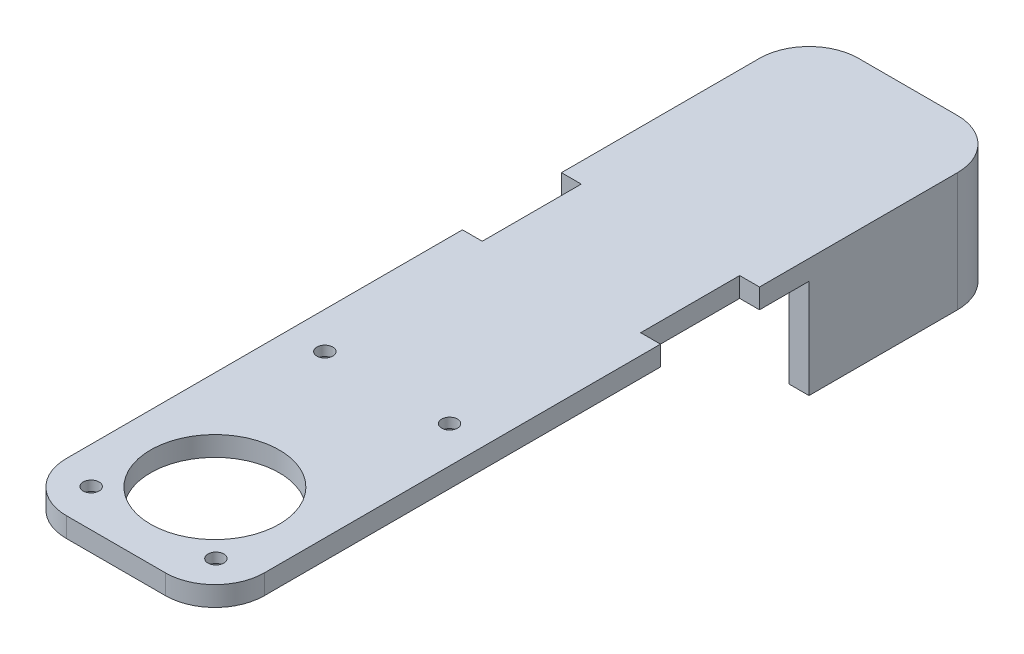
ISO-10303-21;
HEADER;
FILE_DESCRIPTION(('STEP AP214'),'2;1');
FILE_NAME('part.step','',(''),(''),'','','');
FILE_SCHEMA(('AUTOMOTIVE_DESIGN { 1 0 10303 214 1 1 1 1 }'));
ENDSEC;
DATA;
#1=APPLICATION_CONTEXT('core data for automotive mechanical design processes');
#2=APPLICATION_PROTOCOL_DEFINITION('international standard','automotive_design',2000,#1);
#3=PRODUCT_CONTEXT('',#1,'mechanical');
#4=PRODUCT('Part','Part','',(#3));
#5=PRODUCT_RELATED_PRODUCT_CATEGORY('part','',(#4));
#6=PRODUCT_DEFINITION_FORMATION('','',#4);
#7=PRODUCT_DEFINITION_CONTEXT('part definition',#1,'design');
#8=PRODUCT_DEFINITION('design','',#6,#7);
#9=PRODUCT_DEFINITION_SHAPE('','',#8);
#10=(LENGTH_UNIT() NAMED_UNIT(*) SI_UNIT(.MILLI.,.METRE.));
#11=(NAMED_UNIT(*) PLANE_ANGLE_UNIT() SI_UNIT($,.RADIAN.));
#12=(NAMED_UNIT(*) SI_UNIT($,.STERADIAN.) SOLID_ANGLE_UNIT());
#13=UNCERTAINTY_MEASURE_WITH_UNIT(LENGTH_MEASURE(1.E-05),#10,'distance_accuracy_value','');
#14=(GEOMETRIC_REPRESENTATION_CONTEXT(3) GLOBAL_UNCERTAINTY_ASSIGNED_CONTEXT((#13)) GLOBAL_UNIT_ASSIGNED_CONTEXT((#10,
#11,#12)) REPRESENTATION_CONTEXT('',''));
#15=CARTESIAN_POINT('',(0.,0.,0.));
#16=DIRECTION('',(0.,0.,1.));
#17=DIRECTION('',(1.,0.,0.));
#18=AXIS2_PLACEMENT_3D('',#15,#16,#17);
#19=CARTESIAN_POINT('',(-12.7,2.54,12.7));
#20=DIRECTION('',(1.,0.,0.));
#21=DIRECTION('',(0.,0.,-1.));
#22=AXIS2_PLACEMENT_3D('',#19,#20,#21);
#23=PLANE('',#22);
#24=DIRECTION('',(0.,0.,1.));
#25=VECTOR('',#24,1.);
#26=CARTESIAN_POINT('',(-12.7,2.54,12.7));
#27=LINE('',#26,#25);
#28=CARTESIAN_POINT('',(-12.7,2.54,-44.45));
#29=VERTEX_POINT('',#28);
#30=CARTESIAN_POINT('',(-12.7,2.54,6.35));
#31=VERTEX_POINT('',#30);
#32=EDGE_CURVE('E388',#29,#31,#27,.T.);
#33=ORIENTED_EDGE('',*,*,#32,.F.);
#34=DIRECTION('',(0.,-1.,0.));
#35=VECTOR('',#34,1.);
#36=CARTESIAN_POINT('',(-12.7,2.54,-44.45));
#37=LINE('',#36,#35);
#38=CARTESIAN_POINT('',(-12.7,0.,-44.45));
#39=VERTEX_POINT('',#38);
#40=EDGE_CURVE('E253',#29,#39,#37,.T.);
#41=ORIENTED_EDGE('',*,*,#40,.T.);
#42=DIRECTION('',(0.,0.,1.));
#43=VECTOR('',#42,1.);
#44=CARTESIAN_POINT('',(-12.7,0.,12.7));
#45=LINE('',#44,#43);
#46=CARTESIAN_POINT('',(-12.7,0.,6.35));
#47=VERTEX_POINT('',#46);
#48=EDGE_CURVE('E379',#39,#47,#45,.T.);
#49=ORIENTED_EDGE('',*,*,#48,.T.);
#50=DIRECTION('',(0.,-1.,0.));
#51=VECTOR('',#50,1.);
#52=CARTESIAN_POINT('',(-12.7,2.54,6.35));
#53=LINE('',#52,#51);
#54=EDGE_CURVE('E461',#47,#31,#53,.F.);
#55=ORIENTED_EDGE('',*,*,#54,.T.);
#56=EDGE_LOOP('',(#33,#41,#49,#55));
#57=FACE_BOUND('',#56,.T.);
#58=ADVANCED_FACE('F47',(#57),#23,.F.);
#59=CARTESIAN_POINT('',(12.7,2.54,12.7));
#60=DIRECTION('',(-1.,0.,0.));
#61=DIRECTION('',(0.,0.,1.));
#62=AXIS2_PLACEMENT_3D('',#59,#60,#61);
#63=PLANE('',#62);
#64=DIRECTION('',(0.,0.,-1.));
#65=VECTOR('',#64,1.);
#66=CARTESIAN_POINT('',(12.7,0.,12.7));
#67=LINE('',#66,#65);
#68=CARTESIAN_POINT('',(12.7,0.,6.35));
#69=VERTEX_POINT('',#68);
#70=CARTESIAN_POINT('',(12.7,0.,-44.45));
#71=VERTEX_POINT('',#70);
#72=EDGE_CURVE('E410',#69,#71,#67,.T.);
#73=ORIENTED_EDGE('',*,*,#72,.T.);
#74=DIRECTION('',(0.,-1.,0.));
#75=VECTOR('',#74,1.);
#76=CARTESIAN_POINT('',(12.7,2.54,-44.45));
#77=LINE('',#76,#75);
#78=CARTESIAN_POINT('',(12.7,2.54,-44.45));
#79=VERTEX_POINT('',#78);
#80=EDGE_CURVE('E238',#79,#71,#77,.T.);
#81=ORIENTED_EDGE('',*,*,#80,.F.);
#82=DIRECTION('',(0.,0.,-1.));
#83=VECTOR('',#82,1.);
#84=CARTESIAN_POINT('',(12.7,2.54,12.7));
#85=LINE('',#84,#83);
#86=CARTESIAN_POINT('',(12.7,2.54,6.35));
#87=VERTEX_POINT('',#86);
#88=EDGE_CURVE('E393',#87,#79,#85,.T.);
#89=ORIENTED_EDGE('',*,*,#88,.F.);
#90=DIRECTION('',(0.,-1.,0.));
#91=VECTOR('',#90,1.);
#92=CARTESIAN_POINT('',(12.7,2.54,6.35));
#93=LINE('',#92,#91);
#94=EDGE_CURVE('E421',#87,#69,#93,.T.);
#95=ORIENTED_EDGE('',*,*,#94,.T.);
#96=EDGE_LOOP('',(#73,#81,#89,#95));
#97=FACE_BOUND('',#96,.T.);
#98=ADVANCED_FACE('F500',(#97),#63,.F.);
#99=CARTESIAN_POINT('',(-8.000000002,-10.16,-22.098));
#100=DIRECTION('',(0.,1.,0.));
#101=DIRECTION('',(0.,0.,1.));
#102=AXIS2_PLACEMENT_3D('',#99,#100,#101);
#103=CYLINDRICAL_SURFACE('',#102,1.016);
#104=CARTESIAN_POINT('',(-8.000000002,2.54,-22.098));
#105=DIRECTION('',(0.,1.,0.));
#106=DIRECTION('',(0.,0.,1.));
#107=AXIS2_PLACEMENT_3D('',#104,#105,#106);
#108=CIRCLE('',#107,1.016);
#109=CARTESIAN_POINT('',(-8.000000002,2.54,-21.082));
#110=VERTEX_POINT('',#109);
#111=EDGE_CURVE('E317',#110,#110,#108,.T.);
#112=ORIENTED_EDGE('',*,*,#111,.T.);
#113=EDGE_LOOP('',(#112));
#114=FACE_BOUND('',#113,.T.);
#115=CARTESIAN_POINT('',(-8.000000002,1.27,-22.098));
#116=DIRECTION('',(0.,-1.,0.));
#117=DIRECTION('',(0.,0.,-1.));
#118=AXIS2_PLACEMENT_3D('',#115,#116,#117);
#119=CIRCLE('',#118,1.016);
#120=CARTESIAN_POINT('',(-8.000000002,1.27,-23.114));
#121=VERTEX_POINT('',#120);
#122=EDGE_CURVE('E51',#121,#121,#119,.F.);
#123=ORIENTED_EDGE('',*,*,#122,.F.);
#124=EDGE_LOOP('',(#123));
#125=FACE_BOUND('',#124,.T.);
#126=ADVANCED_FACE('F497',(#114,#125),#103,.F.);
#127=CARTESIAN_POINT('',(8.000000002,-10.16,7.874));
#128=DIRECTION('',(0.,1.,0.));
#129=DIRECTION('',(0.,0.,1.));
#130=AXIS2_PLACEMENT_3D('',#127,#128,#129);
#131=CYLINDRICAL_SURFACE('',#130,1.016);
#132=CARTESIAN_POINT('',(8.000000002,2.54,7.874));
#133=DIRECTION('',(0.,1.,0.));
#134=DIRECTION('',(0.,0.,-1.));
#135=AXIS2_PLACEMENT_3D('',#132,#133,#134);
#136=CIRCLE('',#135,1.016);
#137=CARTESIAN_POINT('',(8.000000002,2.54,6.858));
#138=VERTEX_POINT('',#137);
#139=EDGE_CURVE('E308',#138,#138,#136,.T.);
#140=ORIENTED_EDGE('',*,*,#139,.T.);
#141=EDGE_LOOP('',(#140));
#142=FACE_BOUND('',#141,.T.);
#143=CARTESIAN_POINT('',(8.000000002,1.27,7.874));
#144=DIRECTION('',(0.,-1.,0.));
#145=DIRECTION('',(0.,0.,-1.));
#146=AXIS2_PLACEMENT_3D('',#143,#144,#145);
#147=CIRCLE('',#146,1.016);
#148=CARTESIAN_POINT('',(8.000000002,1.27,6.858));
#149=VERTEX_POINT('',#148);
#150=EDGE_CURVE('E486',#149,#149,#147,.F.);
#151=ORIENTED_EDGE('',*,*,#150,.F.);
#152=EDGE_LOOP('',(#151));
#153=FACE_BOUND('',#152,.T.);
#154=ADVANCED_FACE('F499',(#142,#153),#131,.F.);
#155=CARTESIAN_POINT('',(-8.000000002,-10.16,7.874));
#156=DIRECTION('',(0.,1.,0.));
#157=DIRECTION('',(0.,0.,1.));
#158=AXIS2_PLACEMENT_3D('',#155,#156,#157);
#159=CYLINDRICAL_SURFACE('',#158,1.016);
#160=CARTESIAN_POINT('',(-8.000000002,2.54,7.874));
#161=DIRECTION('',(0.,1.,0.));
#162=DIRECTION('',(0.,0.,1.));
#163=AXIS2_PLACEMENT_3D('',#160,#161,#162);
#164=CIRCLE('',#163,1.016);
#165=CARTESIAN_POINT('',(-8.000000002,2.54,8.89));
#166=VERTEX_POINT('',#165);
#167=EDGE_CURVE('E312',#166,#166,#164,.T.);
#168=ORIENTED_EDGE('',*,*,#167,.T.);
#169=EDGE_LOOP('',(#168));
#170=FACE_BOUND('',#169,.T.);
#171=CARTESIAN_POINT('',(-8.000000002,1.27,7.874));
#172=DIRECTION('',(0.,-1.,0.));
#173=DIRECTION('',(0.,0.,-1.));
#174=AXIS2_PLACEMENT_3D('',#171,#172,#173);
#175=CIRCLE('',#174,1.016);
#176=CARTESIAN_POINT('',(-8.000000002,1.27,6.858));
#177=VERTEX_POINT('',#176);
#178=EDGE_CURVE('E483',#177,#177,#175,.F.);
#179=ORIENTED_EDGE('',*,*,#178,.F.);
#180=EDGE_LOOP('',(#179));
#181=FACE_BOUND('',#180,.T.);
#182=ADVANCED_FACE('F507',(#170,#181),#159,.F.);
#183=CARTESIAN_POINT('',(8.000000002,-10.16,-22.098));
#184=DIRECTION('',(0.,1.,0.));
#185=DIRECTION('',(0.,0.,1.));
#186=AXIS2_PLACEMENT_3D('',#183,#184,#185);
#187=CYLINDRICAL_SURFACE('',#186,1.016);
#188=CARTESIAN_POINT('',(8.000000002,2.54,-22.098));
#189=DIRECTION('',(0.,1.,0.));
#190=DIRECTION('',(0.,0.,-1.));
#191=AXIS2_PLACEMENT_3D('',#188,#189,#190);
#192=CIRCLE('',#191,1.016);
#193=CARTESIAN_POINT('',(8.000000002,2.54,-23.114));
#194=VERTEX_POINT('',#193);
#195=EDGE_CURVE('E313',#194,#194,#192,.T.);
#196=ORIENTED_EDGE('',*,*,#195,.T.);
#197=EDGE_LOOP('',(#196));
#198=FACE_BOUND('',#197,.T.);
#199=CARTESIAN_POINT('',(8.000000002,1.27,-22.098));
#200=DIRECTION('',(0.,-1.,0.));
#201=DIRECTION('',(0.,0.,-1.));
#202=AXIS2_PLACEMENT_3D('',#199,#200,#201);
#203=CIRCLE('',#202,1.016);
#204=CARTESIAN_POINT('',(8.000000002,1.27,-23.114));
#205=VERTEX_POINT('',#204);
#206=EDGE_CURVE('E304',#205,#205,#203,.F.);
#207=ORIENTED_EDGE('',*,*,#206,.F.);
#208=EDGE_LOOP('',(#207));
#209=FACE_BOUND('',#208,.T.);
#210=ADVANCED_FACE('F658',(#198,#209),#187,.F.);
#211=CARTESIAN_POINT('',(0.,0.,0.));
#212=DIRECTION('',(0.,-1.,0.));
#213=DIRECTION('',(0.,0.,-1.));
#214=AXIS2_PLACEMENT_3D('',#211,#212,#213);
#215=PLANE('',#214);
#216=DIRECTION('',(-1.,0.,0.));
#217=VECTOR('',#216,1.);
#218=CARTESIAN_POINT('',(10.16,0.,-44.45));
#219=LINE('',#218,#217);
#220=CARTESIAN_POINT('',(10.16,0.,-44.45));
#221=VERTEX_POINT('',#220);
#222=EDGE_CURVE('E221',#71,#221,#219,.T.);
#223=ORIENTED_EDGE('',*,*,#222,.F.);
#224=ORIENTED_EDGE('',*,*,#72,.F.);
#225=CARTESIAN_POINT('',(6.35,0.,6.35));
#226=DIRECTION('',(0.,-1.,0.));
#227=DIRECTION('',(0.,0.,-1.));
#228=AXIS2_PLACEMENT_3D('',#225,#226,#227);
#229=CIRCLE('',#228,6.35);
#230=CARTESIAN_POINT('',(6.35,0.,12.7));
#231=VERTEX_POINT('',#230);
#232=EDGE_CURVE('E435',#69,#231,#229,.T.);
#233=ORIENTED_EDGE('',*,*,#232,.T.);
#234=DIRECTION('',(1.,0.,0.));
#235=VECTOR('',#234,1.);
#236=CARTESIAN_POINT('',(-12.7,0.,12.7));
#237=LINE('',#236,#235);
#238=CARTESIAN_POINT('',(-6.35,0.,12.7));
#239=VERTEX_POINT('',#238);
#240=EDGE_CURVE('E405',#239,#231,#237,.T.);
#241=ORIENTED_EDGE('',*,*,#240,.F.);
#242=CARTESIAN_POINT('',(-6.35,0.,6.35));
#243=DIRECTION('',(0.,-1.,0.));
#244=DIRECTION('',(0.,0.,-1.));
#245=AXIS2_PLACEMENT_3D('',#242,#243,#244);
#246=CIRCLE('',#245,6.35);
#247=EDGE_CURVE('E431',#239,#47,#246,.T.);
#248=ORIENTED_EDGE('',*,*,#247,.T.);
#249=ORIENTED_EDGE('',*,*,#48,.F.);
#250=DIRECTION('',(-1.,0.,0.));
#251=VECTOR('',#250,1.);
#252=CARTESIAN_POINT('',(-12.7,0.,-44.45));
#253=LINE('',#252,#251);
#254=CARTESIAN_POINT('',(-10.16,0.,-44.45));
#255=VERTEX_POINT('',#254);
#256=EDGE_CURVE('E257',#255,#39,#253,.T.);
#257=ORIENTED_EDGE('',*,*,#256,.F.);
#258=DIRECTION('',(0.,0.,1.));
#259=VECTOR('',#258,1.);
#260=CARTESIAN_POINT('',(-10.16,0.,-44.45));
#261=LINE('',#260,#259);
#262=CARTESIAN_POINT('',(-10.16,0.,-57.15));
#263=VERTEX_POINT('',#262);
#264=EDGE_CURVE('E260',#263,#255,#261,.T.);
#265=ORIENTED_EDGE('',*,*,#264,.F.);
#266=DIRECTION('',(1.,0.,0.));
#267=VECTOR('',#266,1.);
#268=CARTESIAN_POINT('',(-12.7,0.,-57.15));
#269=LINE('',#268,#267);
#270=CARTESIAN_POINT('',(-12.7,0.,-57.15));
#271=VERTEX_POINT('',#270);
#272=EDGE_CURVE('E231',#271,#263,#269,.T.);
#273=ORIENTED_EDGE('',*,*,#272,.F.);
#274=CARTESIAN_POINT('',(-12.7,0.,-63.5));
#275=VERTEX_POINT('',#274);
#276=EDGE_CURVE('E401',#275,#271,#45,.T.);
#277=ORIENTED_EDGE('',*,*,#276,.F.);
#278=DIRECTION('',(-1.,0.,0.));
#279=VECTOR('',#278,1.);
#280=CARTESIAN_POINT('',(-12.7,0.,-63.5));
#281=LINE('',#280,#279);
#282=CARTESIAN_POINT('',(-10.16,0.,-63.5));
#283=VERTEX_POINT('',#282);
#284=EDGE_CURVE('E355',#283,#275,#281,.T.);
#285=ORIENTED_EDGE('',*,*,#284,.F.);
#286=DIRECTION('',(0.,0.,1.));
#287=VECTOR('',#286,1.);
#288=CARTESIAN_POINT('',(-10.16,0.,-88.9));
#289=LINE('',#288,#287);
#290=CARTESIAN_POINT('',(-10.16,0.,-87.63));
#291=VERTEX_POINT('',#290);
#292=EDGE_CURVE('E341',#291,#283,#289,.T.);
#293=ORIENTED_EDGE('',*,*,#292,.F.);
#294=CARTESIAN_POINT('',(-6.35,0.,-82.55));
#295=DIRECTION('',(0.,-1.,0.));
#296=DIRECTION('',(0.,0.,-1.));
#297=AXIS2_PLACEMENT_3D('',#294,#295,#296);
#298=CIRCLE('',#297,6.35);
#299=CARTESIAN_POINT('',(-6.35,0.,-88.9));
#300=VERTEX_POINT('',#299);
#301=EDGE_CURVE('E425',#291,#300,#298,.T.);
#302=ORIENTED_EDGE('',*,*,#301,.T.);
#303=DIRECTION('',(-1.,0.,0.));
#304=VECTOR('',#303,1.);
#305=CARTESIAN_POINT('',(-12.7,0.,-88.9));
#306=LINE('',#305,#304);
#307=CARTESIAN_POINT('',(6.35,0.,-88.9));
#308=VERTEX_POINT('',#307);
#309=EDGE_CURVE('E414',#308,#300,#306,.T.);
#310=ORIENTED_EDGE('',*,*,#309,.F.);
#311=CARTESIAN_POINT('',(6.35,0.,-82.55));
#312=DIRECTION('',(0.,-1.,0.));
#313=DIRECTION('',(0.,0.,-1.));
#314=AXIS2_PLACEMENT_3D('',#311,#312,#313);
#315=CIRCLE('',#314,6.35);
#316=CARTESIAN_POINT('',(10.16,0.,-87.63));
#317=VERTEX_POINT('',#316);
#318=EDGE_CURVE('E428',#308,#317,#315,.T.);
#319=ORIENTED_EDGE('',*,*,#318,.T.);
#320=DIRECTION('',(0.,0.,-1.));
#321=VECTOR('',#320,1.);
#322=CARTESIAN_POINT('',(10.16,0.,-88.9));
#323=LINE('',#322,#321);
#324=CARTESIAN_POINT('',(10.16,0.,-63.5));
#325=VERTEX_POINT('',#324);
#326=EDGE_CURVE('E333',#325,#317,#323,.T.);
#327=ORIENTED_EDGE('',*,*,#326,.F.);
#328=DIRECTION('',(-1.,0.,0.));
#329=VECTOR('',#328,1.);
#330=CARTESIAN_POINT('',(12.7,0.,-63.5));
#331=LINE('',#330,#329);
#332=CARTESIAN_POINT('',(12.7,0.,-63.5));
#333=VERTEX_POINT('',#332);
#334=EDGE_CURVE('E337',#333,#325,#331,.T.);
#335=ORIENTED_EDGE('',*,*,#334,.F.);
#336=CARTESIAN_POINT('',(12.7,0.,-57.15));
#337=VERTEX_POINT('',#336);
#338=EDGE_CURVE('E409',#337,#333,#67,.T.);
#339=ORIENTED_EDGE('',*,*,#338,.F.);
#340=DIRECTION('',(1.,0.,0.));
#341=VECTOR('',#340,1.);
#342=CARTESIAN_POINT('',(10.16,0.,-57.15));
#343=LINE('',#342,#341);
#344=CARTESIAN_POINT('',(10.16,0.,-57.15));
#345=VERTEX_POINT('',#344);
#346=EDGE_CURVE('E73',#345,#337,#343,.T.);
#347=ORIENTED_EDGE('',*,*,#346,.F.);
#348=DIRECTION('',(0.,0.,-1.));
#349=VECTOR('',#348,1.);
#350=CARTESIAN_POINT('',(10.16,0.,-44.45));
#351=LINE('',#350,#349);
#352=EDGE_CURVE('E205',#221,#345,#351,.T.);
#353=ORIENTED_EDGE('',*,*,#352,.F.);
#354=EDGE_LOOP('',(#223,#224,#233,#241,#248,#249,#257,#265,#273,#277,#285,#293,#302,#310,#319,
#327,#335,#339,#347,#353));
#355=FACE_BOUND('',#354,.T.);
#356=CARTESIAN_POINT('',(-8.000000002,0.,7.874));
#357=DIRECTION('',(0.,-1.,0.));
#358=DIRECTION('',(0.,0.,-1.));
#359=AXIS2_PLACEMENT_3D('',#356,#357,#358);
#360=CIRCLE('',#359,2.032);
#361=CARTESIAN_POINT('',(-8.000000002,0.,5.842));
#362=VERTEX_POINT('',#361);
#363=EDGE_CURVE('E293',#362,#362,#360,.T.);
#364=ORIENTED_EDGE('',*,*,#363,.F.);
#365=EDGE_LOOP('',(#364));
#366=FACE_BOUND('',#365,.T.);
#367=CARTESIAN_POINT('',(8.000000002,0.,7.874));
#368=DIRECTION('',(0.,-1.,0.));
#369=DIRECTION('',(0.,0.,-1.));
#370=AXIS2_PLACEMENT_3D('',#367,#368,#369);
#371=CIRCLE('',#370,2.032);
#372=CARTESIAN_POINT('',(8.000000002,0.,5.842));
#373=VERTEX_POINT('',#372);
#374=EDGE_CURVE('E285',#373,#373,#371,.T.);
#375=ORIENTED_EDGE('',*,*,#374,.F.);
#376=EDGE_LOOP('',(#375));
#377=FACE_BOUND('',#376,.T.);
#378=CARTESIAN_POINT('',(8.000000002,0.,-22.098));
#379=DIRECTION('',(0.,-1.,0.));
#380=DIRECTION('',(0.,0.,-1.));
#381=AXIS2_PLACEMENT_3D('',#378,#379,#380);
#382=CIRCLE('',#381,2.032);
#383=CARTESIAN_POINT('',(8.000000002,0.,-24.13));
#384=VERTEX_POINT('',#383);
#385=EDGE_CURVE('E276',#384,#384,#382,.T.);
#386=ORIENTED_EDGE('',*,*,#385,.F.);
#387=EDGE_LOOP('',(#386));
#388=FACE_BOUND('',#387,.T.);
#389=CARTESIAN_POINT('',(-8.000000002,0.,-22.098));
#390=DIRECTION('',(0.,-1.,0.));
#391=DIRECTION('',(0.,0.,-1.));
#392=AXIS2_PLACEMENT_3D('',#389,#390,#391);
#393=CIRCLE('',#392,2.032);
#394=CARTESIAN_POINT('',(-8.000000002,0.,-24.13));
#395=VERTEX_POINT('',#394);
#396=EDGE_CURVE('E280',#395,#395,#393,.T.);
#397=ORIENTED_EDGE('',*,*,#396,.F.);
#398=EDGE_LOOP('',(#397));
#399=FACE_BOUND('',#398,.T.);
#400=CARTESIAN_POINT('',(0.,0.,0.));
#401=DIRECTION('',(0.,1.,0.));
#402=DIRECTION('',(0.,0.,1.));
#403=AXIS2_PLACEMENT_3D('',#400,#401,#402);
#404=CIRCLE('',#403,8.255);
#405=CARTESIAN_POINT('',(0.,0.,8.255));
#406=VERTEX_POINT('',#405);
#407=EDGE_CURVE('E374',#406,#406,#404,.T.);
#408=ORIENTED_EDGE('',*,*,#407,.T.);
#409=EDGE_LOOP('',(#408));
#410=FACE_BOUND('',#409,.T.);
#411=ADVANCED_FACE('F535',(#355,#366,#377,#388,#399,#410),#215,.T.);
#412=CARTESIAN_POINT('',(0.,2.54,0.));
#413=DIRECTION('',(0.,-1.,0.));
#414=DIRECTION('',(0.,0.,-1.));
#415=AXIS2_PLACEMENT_3D('',#412,#413,#414);
#416=PLANE('',#415);
#417=ORIENTED_EDGE('',*,*,#195,.F.);
#418=EDGE_LOOP('',(#417));
#419=FACE_BOUND('',#418,.T.);
#420=ORIENTED_EDGE('',*,*,#167,.F.);
#421=EDGE_LOOP('',(#420));
#422=FACE_BOUND('',#421,.T.);
#423=ORIENTED_EDGE('',*,*,#139,.F.);
#424=EDGE_LOOP('',(#423));
#425=FACE_BOUND('',#424,.T.);
#426=ORIENTED_EDGE('',*,*,#111,.F.);
#427=EDGE_LOOP('',(#426));
#428=FACE_BOUND('',#427,.T.);
#429=ORIENTED_EDGE('',*,*,#88,.T.);
#430=DIRECTION('',(-1.,0.,0.));
#431=VECTOR('',#430,1.);
#432=CARTESIAN_POINT('',(10.16,2.54,-44.45));
#433=LINE('',#432,#431);
#434=CARTESIAN_POINT('',(10.16,2.54,-44.45));
#435=VERTEX_POINT('',#434);
#436=EDGE_CURVE('E208',#79,#435,#433,.T.);
#437=ORIENTED_EDGE('',*,*,#436,.T.);
#438=DIRECTION('',(0.,0.,-1.));
#439=VECTOR('',#438,1.);
#440=CARTESIAN_POINT('',(10.16,2.54,-44.45));
#441=LINE('',#440,#439);
#442=CARTESIAN_POINT('',(10.16,2.54,-57.15));
#443=VERTEX_POINT('',#442);
#444=EDGE_CURVE('E202',#435,#443,#441,.T.);
#445=ORIENTED_EDGE('',*,*,#444,.T.);
#446=DIRECTION('',(1.,0.,0.));
#447=VECTOR('',#446,1.);
#448=CARTESIAN_POINT('',(10.16,2.54,-57.15));
#449=LINE('',#448,#447);
#450=CARTESIAN_POINT('',(12.7,2.54,-57.15));
#451=VERTEX_POINT('',#450);
#452=EDGE_CURVE('E211',#443,#451,#449,.T.);
#453=ORIENTED_EDGE('',*,*,#452,.T.);
#454=CARTESIAN_POINT('',(12.7,2.54,-82.55));
#455=VERTEX_POINT('',#454);
#456=EDGE_CURVE('E392',#451,#455,#85,.T.);
#457=ORIENTED_EDGE('',*,*,#456,.T.);
#458=CARTESIAN_POINT('',(6.35,2.54,-82.55));
#459=DIRECTION('',(0.,-1.,0.));
#460=DIRECTION('',(0.,0.,-1.));
#461=AXIS2_PLACEMENT_3D('',#458,#459,#460);
#462=CIRCLE('',#461,6.35);
#463=CARTESIAN_POINT('',(6.35,2.54,-88.9));
#464=VERTEX_POINT('',#463);
#465=EDGE_CURVE('E448',#455,#464,#462,.F.);
#466=ORIENTED_EDGE('',*,*,#465,.T.);
#467=DIRECTION('',(-1.,0.,0.));
#468=VECTOR('',#467,1.);
#469=CARTESIAN_POINT('',(-12.7,2.54,-88.9));
#470=LINE('',#469,#468);
#471=CARTESIAN_POINT('',(-6.35,2.54,-88.9));
#472=VERTEX_POINT('',#471);
#473=EDGE_CURVE('E396',#464,#472,#470,.T.);
#474=ORIENTED_EDGE('',*,*,#473,.T.);
#475=CARTESIAN_POINT('',(-6.35,2.54,-82.55));
#476=DIRECTION('',(0.,-1.,0.));
#477=DIRECTION('',(0.,0.,-1.));
#478=AXIS2_PLACEMENT_3D('',#475,#476,#477);
#479=CIRCLE('',#478,6.35);
#480=CARTESIAN_POINT('',(-12.7,2.54,-82.55));
#481=VERTEX_POINT('',#480);
#482=EDGE_CURVE('E445',#472,#481,#479,.F.);
#483=ORIENTED_EDGE('',*,*,#482,.T.);
#484=CARTESIAN_POINT('',(-12.7,2.54,-57.15));
#485=VERTEX_POINT('',#484);
#486=EDGE_CURVE('E383',#481,#485,#27,.T.);
#487=ORIENTED_EDGE('',*,*,#486,.T.);
#488=DIRECTION('',(1.,0.,0.));
#489=VECTOR('',#488,1.);
#490=CARTESIAN_POINT('',(-12.7,2.54,-57.15));
#491=LINE('',#490,#489);
#492=CARTESIAN_POINT('',(-10.16,2.54,-57.15));
#493=VERTEX_POINT('',#492);
#494=EDGE_CURVE('E65',#485,#493,#491,.T.);
#495=ORIENTED_EDGE('',*,*,#494,.T.);
#496=DIRECTION('',(0.,0.,1.));
#497=VECTOR('',#496,1.);
#498=CARTESIAN_POINT('',(-10.16,2.54,-44.45));
#499=LINE('',#498,#497);
#500=CARTESIAN_POINT('',(-10.16,2.54,-44.45));
#501=VERTEX_POINT('',#500);
#502=EDGE_CURVE('E270',#493,#501,#499,.T.);
#503=ORIENTED_EDGE('',*,*,#502,.T.);
#504=DIRECTION('',(-1.,0.,0.));
#505=VECTOR('',#504,1.);
#506=CARTESIAN_POINT('',(-12.7,2.54,-44.45));
#507=LINE('',#506,#505);
#508=EDGE_CURVE('E246',#501,#29,#507,.T.);
#509=ORIENTED_EDGE('',*,*,#508,.T.);
#510=ORIENTED_EDGE('',*,*,#32,.T.);
#511=CARTESIAN_POINT('',(-6.35,2.54,6.35));
#512=DIRECTION('',(0.,-1.,0.));
#513=DIRECTION('',(0.,0.,-1.));
#514=AXIS2_PLACEMENT_3D('',#511,#512,#513);
#515=CIRCLE('',#514,6.35);
#516=CARTESIAN_POINT('',(-6.35,2.54,12.7));
#517=VERTEX_POINT('',#516);
#518=EDGE_CURVE('E451',#31,#517,#515,.F.);
#519=ORIENTED_EDGE('',*,*,#518,.T.);
#520=DIRECTION('',(1.,0.,0.));
#521=VECTOR('',#520,1.);
#522=CARTESIAN_POINT('',(-12.7,2.54,12.7));
#523=LINE('',#522,#521);
#524=CARTESIAN_POINT('',(6.35,2.54,12.7));
#525=VERTEX_POINT('',#524);
#526=EDGE_CURVE('E387',#517,#525,#523,.T.);
#527=ORIENTED_EDGE('',*,*,#526,.T.);
#528=CARTESIAN_POINT('',(6.35,2.54,6.35));
#529=DIRECTION('',(0.,-1.,0.));
#530=DIRECTION('',(0.,0.,-1.));
#531=AXIS2_PLACEMENT_3D('',#528,#529,#530);
#532=CIRCLE('',#531,6.35);
#533=EDGE_CURVE('E454',#525,#87,#532,.F.);
#534=ORIENTED_EDGE('',*,*,#533,.T.);
#535=EDGE_LOOP('',(#429,#437,#445,#453,#457,#466,#474,#483,#487,#495,#503,#509,#510,#519,#527,#534));
#536=FACE_BOUND('',#535,.T.);
#537=CARTESIAN_POINT('',(0.,2.54,0.));
#538=DIRECTION('',(0.,1.,0.));
#539=DIRECTION('',(0.,0.,1.));
#540=AXIS2_PLACEMENT_3D('',#537,#538,#539);
#541=CIRCLE('',#540,8.255);
#542=CARTESIAN_POINT('',(0.,2.54,8.255));
#543=VERTEX_POINT('',#542);
#544=EDGE_CURVE('E375',#543,#543,#541,.T.);
#545=ORIENTED_EDGE('',*,*,#544,.F.);
#546=EDGE_LOOP('',(#545));
#547=FACE_BOUND('',#546,.T.);
#548=ADVANCED_FACE('F218',(#419,#422,#425,#428,#536,#547),#416,.F.);
#549=ORIENTED_EDGE('',*,*,#276,.T.);
#550=DIRECTION('',(0.,-1.,0.));
#551=VECTOR('',#550,1.);
#552=CARTESIAN_POINT('',(-12.7,2.54,-57.15));
#553=LINE('',#552,#551);
#554=EDGE_CURVE('E243',#485,#271,#553,.T.);
#555=ORIENTED_EDGE('',*,*,#554,.F.);
#556=ORIENTED_EDGE('',*,*,#486,.F.);
#557=DIRECTION('',(0.,-1.,0.));
#558=VECTOR('',#557,1.);
#559=CARTESIAN_POINT('',(-12.7,2.54,-82.55));
#560=LINE('',#559,#558);
#561=CARTESIAN_POINT('',(-12.7,-12.7,-82.55));
#562=VERTEX_POINT('',#561);
#563=EDGE_CURVE('E457',#481,#562,#560,.T.);
#564=ORIENTED_EDGE('',*,*,#563,.T.);
#565=DIRECTION('',(0.,0.,-1.));
#566=VECTOR('',#565,1.);
#567=CARTESIAN_POINT('',(-12.7,-12.7,-88.9));
#568=LINE('',#567,#566);
#569=CARTESIAN_POINT('',(-12.7,-12.7,-63.5));
#570=VERTEX_POINT('',#569);
#571=EDGE_CURVE('E350',#570,#562,#568,.T.);
#572=ORIENTED_EDGE('',*,*,#571,.F.);
#573=DIRECTION('',(0.,1.,0.));
#574=VECTOR('',#573,1.);
#575=CARTESIAN_POINT('',(-12.7,-12.7,-63.5));
#576=LINE('',#575,#574);
#577=EDGE_CURVE('E361',#570,#275,#576,.T.);
#578=ORIENTED_EDGE('',*,*,#577,.T.);
#579=EDGE_LOOP('',(#549,#555,#556,#564,#572,#578));
#580=FACE_BOUND('',#579,.T.);
#581=ADVANCED_FACE('F519',(#580),#23,.F.);
#582=CARTESIAN_POINT('',(-12.7,2.54,12.7));
#583=DIRECTION('',(0.,0.,-1.));
#584=DIRECTION('',(-1.,0.,0.));
#585=AXIS2_PLACEMENT_3D('',#582,#583,#584);
#586=PLANE('',#585);
#587=ORIENTED_EDGE('',*,*,#240,.T.);
#588=DIRECTION('',(0.,-1.,0.));
#589=VECTOR('',#588,1.);
#590=CARTESIAN_POINT('',(6.35,2.54,12.7));
#591=LINE('',#590,#589);
#592=EDGE_CURVE('E442',#231,#525,#591,.F.);
#593=ORIENTED_EDGE('',*,*,#592,.T.);
#594=ORIENTED_EDGE('',*,*,#526,.F.);
#595=DIRECTION('',(0.,-1.,0.));
#596=VECTOR('',#595,1.);
#597=CARTESIAN_POINT('',(-6.35,2.54,12.7));
#598=LINE('',#597,#596);
#599=EDGE_CURVE('E438',#517,#239,#598,.T.);
#600=ORIENTED_EDGE('',*,*,#599,.T.);
#601=EDGE_LOOP('',(#587,#593,#594,#600));
#602=FACE_BOUND('',#601,.T.);
#603=ADVANCED_FACE('F527',(#602),#586,.F.);
#604=ORIENTED_EDGE('',*,*,#456,.F.);
#605=DIRECTION('',(0.,-1.,0.));
#606=VECTOR('',#605,1.);
#607=CARTESIAN_POINT('',(12.7,2.54,-57.15));
#608=LINE('',#607,#606);
#609=EDGE_CURVE('E207',#451,#337,#608,.T.);
#610=ORIENTED_EDGE('',*,*,#609,.T.);
#611=ORIENTED_EDGE('',*,*,#338,.T.);
#612=DIRECTION('',(0.,1.,0.));
#613=VECTOR('',#612,1.);
#614=CARTESIAN_POINT('',(12.7,-12.7,-63.5));
#615=LINE('',#614,#613);
#616=CARTESIAN_POINT('',(12.7,-12.7,-63.5));
#617=VERTEX_POINT('',#616);
#618=EDGE_CURVE('E324',#617,#333,#615,.T.);
#619=ORIENTED_EDGE('',*,*,#618,.F.);
#620=DIRECTION('',(0.,0.,1.));
#621=VECTOR('',#620,1.);
#622=CARTESIAN_POINT('',(12.7,-12.7,-88.9));
#623=LINE('',#622,#621);
#624=CARTESIAN_POINT('',(12.7,-12.7,-82.55));
#625=VERTEX_POINT('',#624);
#626=EDGE_CURVE('E338',#625,#617,#623,.T.);
#627=ORIENTED_EDGE('',*,*,#626,.F.);
#628=DIRECTION('',(0.,-1.,0.));
#629=VECTOR('',#628,1.);
#630=CARTESIAN_POINT('',(12.7,2.54,-82.55));
#631=LINE('',#630,#629);
#632=EDGE_CURVE('E400',#625,#455,#631,.F.);
#633=ORIENTED_EDGE('',*,*,#632,.T.);
#634=EDGE_LOOP('',(#604,#610,#611,#619,#627,#633));
#635=FACE_BOUND('',#634,.T.);
#636=ADVANCED_FACE('F513',(#635),#63,.F.);
#637=CARTESIAN_POINT('',(-12.7,2.54,-88.9));
#638=DIRECTION('',(0.,0.,1.));
#639=DIRECTION('',(1.,0.,0.));
#640=AXIS2_PLACEMENT_3D('',#637,#638,#639);
#641=PLANE('',#640);
#642=ORIENTED_EDGE('',*,*,#473,.F.);
#643=DIRECTION('',(0.,-1.,0.));
#644=VECTOR('',#643,1.);
#645=CARTESIAN_POINT('',(6.35,2.54,-88.9));
#646=LINE('',#645,#644);
#647=EDGE_CURVE('E468',#464,#308,#646,.T.);
#648=ORIENTED_EDGE('',*,*,#647,.T.);
#649=ORIENTED_EDGE('',*,*,#309,.T.);
#650=DIRECTION('',(0.,-1.,0.));
#651=VECTOR('',#650,1.);
#652=CARTESIAN_POINT('',(-6.35,2.54,-88.9));
#653=LINE('',#652,#651);
#654=EDGE_CURVE('E465',#300,#472,#653,.F.);
#655=ORIENTED_EDGE('',*,*,#654,.T.);
#656=EDGE_LOOP('',(#642,#648,#649,#655));
#657=FACE_BOUND('',#656,.T.);
#658=ADVANCED_FACE('F564',(#657),#641,.F.);
#659=CARTESIAN_POINT('',(0.,2.54,0.));
#660=DIRECTION('',(0.,-1.,0.));
#661=DIRECTION('',(0.,0.,-1.));
#662=AXIS2_PLACEMENT_3D('',#659,#660,#661);
#663=CYLINDRICAL_SURFACE('',#662,8.255);
#664=ORIENTED_EDGE('',*,*,#544,.T.);
#665=EDGE_LOOP('',(#664));
#666=FACE_BOUND('',#665,.T.);
#667=ORIENTED_EDGE('',*,*,#407,.F.);
#668=EDGE_LOOP('',(#667));
#669=FACE_BOUND('',#668,.T.);
#670=ADVANCED_FACE('F794',(#666,#669),#663,.F.);
#671=CARTESIAN_POINT('',(-10.16,-12.7,-88.9));
#672=DIRECTION('',(-1.,0.,0.));
#673=DIRECTION('',(0.,0.,1.));
#674=AXIS2_PLACEMENT_3D('',#671,#672,#673);
#675=PLANE('',#674);
#676=DIRECTION('',(0.,0.,1.));
#677=VECTOR('',#676,1.);
#678=CARTESIAN_POINT('',(-10.16,-12.7,-88.9));
#679=LINE('',#678,#677);
#680=CARTESIAN_POINT('',(-10.16,-12.7,-87.63));
#681=VERTEX_POINT('',#680);
#682=CARTESIAN_POINT('',(-10.16,-12.7,-63.5));
#683=VERTEX_POINT('',#682);
#684=EDGE_CURVE('E354',#681,#683,#679,.T.);
#685=ORIENTED_EDGE('',*,*,#684,.F.);
#686=DIRECTION('',(0.,-1.,0.));
#687=VECTOR('',#686,1.);
#688=CARTESIAN_POINT('',(-10.16,-12.7,-87.63));
#689=LINE('',#688,#687);
#690=EDGE_CURVE('E11',#681,#291,#689,.F.);
#691=ORIENTED_EDGE('',*,*,#690,.T.);
#692=ORIENTED_EDGE('',*,*,#292,.T.);
#693=DIRECTION('',(0.,1.,0.));
#694=VECTOR('',#693,1.);
#695=CARTESIAN_POINT('',(-10.16,-12.7,-63.5));
#696=LINE('',#695,#694);
#697=EDGE_CURVE('E370',#683,#283,#696,.T.);
#698=ORIENTED_EDGE('',*,*,#697,.F.);
#699=EDGE_LOOP('',(#685,#691,#692,#698));
#700=FACE_BOUND('',#699,.T.);
#701=ADVANCED_FACE('F554',(#700),#675,.F.);
#702=CARTESIAN_POINT('',(-12.7,-12.7,-63.5));
#703=DIRECTION('',(0.,0.,-1.));
#704=DIRECTION('',(-1.,0.,0.));
#705=AXIS2_PLACEMENT_3D('',#702,#703,#704);
#706=PLANE('',#705);
#707=ORIENTED_EDGE('',*,*,#284,.T.);
#708=ORIENTED_EDGE('',*,*,#577,.F.);
#709=DIRECTION('',(-1.,0.,0.));
#710=VECTOR('',#709,1.);
#711=CARTESIAN_POINT('',(-12.7,-12.7,-63.5));
#712=LINE('',#711,#710);
#713=EDGE_CURVE('E358',#683,#570,#712,.T.);
#714=ORIENTED_EDGE('',*,*,#713,.F.);
#715=ORIENTED_EDGE('',*,*,#697,.T.);
#716=EDGE_LOOP('',(#707,#708,#714,#715));
#717=FACE_BOUND('',#716,.T.);
#718=ADVANCED_FACE('F549',(#717),#706,.F.);
#719=CARTESIAN_POINT('',(0.,-12.7,0.));
#720=DIRECTION('',(0.,1.,0.));
#721=DIRECTION('',(0.,0.,1.));
#722=AXIS2_PLACEMENT_3D('',#719,#720,#721);
#723=PLANE('',#722);
#724=ORIENTED_EDGE('',*,*,#571,.T.);
#725=CARTESIAN_POINT('',(-6.35,-12.7,-82.55));
#726=DIRECTION('',(0.,1.,0.));
#727=DIRECTION('',(0.,0.,1.));
#728=AXIS2_PLACEMENT_3D('',#725,#726,#727);
#729=CIRCLE('',#728,6.35);
#730=EDGE_CURVE('E57',#562,#681,#729,.F.);
#731=ORIENTED_EDGE('',*,*,#730,.T.);
#732=ORIENTED_EDGE('',*,*,#684,.T.);
#733=ORIENTED_EDGE('',*,*,#713,.T.);
#734=EDGE_LOOP('',(#724,#731,#732,#733));
#735=FACE_BOUND('',#734,.T.);
#736=ADVANCED_FACE('F819',(#735),#723,.F.);
#737=CARTESIAN_POINT('',(12.7,-12.7,-63.5));
#738=DIRECTION('',(0.,0.,-1.));
#739=DIRECTION('',(-1.,0.,0.));
#740=AXIS2_PLACEMENT_3D('',#737,#738,#739);
#741=PLANE('',#740);
#742=ORIENTED_EDGE('',*,*,#334,.T.);
#743=DIRECTION('',(0.,1.,0.));
#744=VECTOR('',#743,1.);
#745=CARTESIAN_POINT('',(10.16,-12.7,-63.5));
#746=LINE('',#745,#744);
#747=CARTESIAN_POINT('',(10.16,-12.7,-63.5));
#748=VERTEX_POINT('',#747);
#749=EDGE_CURVE('E328',#748,#325,#746,.T.);
#750=ORIENTED_EDGE('',*,*,#749,.F.);
#751=DIRECTION('',(-1.,0.,0.));
#752=VECTOR('',#751,1.);
#753=CARTESIAN_POINT('',(12.7,-12.7,-63.5));
#754=LINE('',#753,#752);
#755=EDGE_CURVE('E345',#617,#748,#754,.T.);
#756=ORIENTED_EDGE('',*,*,#755,.F.);
#757=ORIENTED_EDGE('',*,*,#618,.T.);
#758=EDGE_LOOP('',(#742,#750,#756,#757));
#759=FACE_BOUND('',#758,.T.);
#760=ADVANCED_FACE('F586',(#759),#741,.F.);
#761=CARTESIAN_POINT('',(10.16,-12.7,-88.9));
#762=DIRECTION('',(1.,0.,0.));
#763=DIRECTION('',(0.,0.,-1.));
#764=AXIS2_PLACEMENT_3D('',#761,#762,#763);
#765=PLANE('',#764);
#766=ORIENTED_EDGE('',*,*,#326,.T.);
#767=DIRECTION('',(0.,-1.,0.));
#768=VECTOR('',#767,1.);
#769=CARTESIAN_POINT('',(10.16,0.,-87.63));
#770=LINE('',#769,#768);
#771=CARTESIAN_POINT('',(10.16,-12.7,-87.63));
#772=VERTEX_POINT('',#771);
#773=EDGE_CURVE('E472',#317,#772,#770,.T.);
#774=ORIENTED_EDGE('',*,*,#773,.T.);
#775=DIRECTION('',(0.,0.,-1.));
#776=VECTOR('',#775,1.);
#777=CARTESIAN_POINT('',(10.16,-12.7,-88.9));
#778=LINE('',#777,#776);
#779=EDGE_CURVE('E332',#748,#772,#778,.T.);
#780=ORIENTED_EDGE('',*,*,#779,.F.);
#781=ORIENTED_EDGE('',*,*,#749,.T.);
#782=EDGE_LOOP('',(#766,#774,#780,#781));
#783=FACE_BOUND('',#782,.T.);
#784=ADVANCED_FACE('F575',(#783),#765,.F.);
#785=CARTESIAN_POINT('',(0.,-12.7,0.));
#786=DIRECTION('',(0.,-1.,0.));
#787=DIRECTION('',(0.,0.,-1.));
#788=AXIS2_PLACEMENT_3D('',#785,#786,#787);
#789=PLANE('',#788);
#790=ORIENTED_EDGE('',*,*,#779,.T.);
#791=CARTESIAN_POINT('',(6.35,-12.7,-82.55));
#792=DIRECTION('',(0.,-1.,0.));
#793=DIRECTION('',(0.,0.,-1.));
#794=AXIS2_PLACEMENT_3D('',#791,#792,#793);
#795=CIRCLE('',#794,6.35);
#796=EDGE_CURVE('E475',#772,#625,#795,.T.);
#797=ORIENTED_EDGE('',*,*,#796,.T.);
#798=ORIENTED_EDGE('',*,*,#626,.T.);
#799=ORIENTED_EDGE('',*,*,#755,.T.);
#800=EDGE_LOOP('',(#790,#797,#798,#799));
#801=FACE_BOUND('',#800,.T.);
#802=ADVANCED_FACE('F580',(#801),#789,.T.);
#803=CARTESIAN_POINT('',(6.35,2.54,6.35));
#804=DIRECTION('',(0.,-1.,0.));
#805=DIRECTION('',(0.,0.,-1.));
#806=AXIS2_PLACEMENT_3D('',#803,#804,#805);
#807=CYLINDRICAL_SURFACE('',#806,6.35);
#808=ORIENTED_EDGE('',*,*,#533,.F.);
#809=ORIENTED_EDGE('',*,*,#592,.F.);
#810=ORIENTED_EDGE('',*,*,#232,.F.);
#811=ORIENTED_EDGE('',*,*,#94,.F.);
#812=EDGE_LOOP('',(#808,#809,#810,#811));
#813=FACE_BOUND('',#812,.T.);
#814=ADVANCED_FACE('F601',(#813),#807,.T.);
#815=CARTESIAN_POINT('',(-6.35,2.54,6.35));
#816=DIRECTION('',(0.,-1.,0.));
#817=DIRECTION('',(0.,0.,-1.));
#818=AXIS2_PLACEMENT_3D('',#815,#816,#817);
#819=CYLINDRICAL_SURFACE('',#818,6.35);
#820=ORIENTED_EDGE('',*,*,#518,.F.);
#821=ORIENTED_EDGE('',*,*,#54,.F.);
#822=ORIENTED_EDGE('',*,*,#247,.F.);
#823=ORIENTED_EDGE('',*,*,#599,.F.);
#824=EDGE_LOOP('',(#820,#821,#822,#823));
#825=FACE_BOUND('',#824,.T.);
#826=ADVANCED_FACE('F596',(#825),#819,.T.);
#827=CARTESIAN_POINT('',(6.35,2.54,-82.55));
#828=DIRECTION('',(0.,-1.,0.));
#829=DIRECTION('',(0.,0.,-1.));
#830=AXIS2_PLACEMENT_3D('',#827,#828,#829);
#831=CYLINDRICAL_SURFACE('',#830,6.35);
#832=ORIENTED_EDGE('',*,*,#465,.F.);
#833=ORIENTED_EDGE('',*,*,#632,.F.);
#834=ORIENTED_EDGE('',*,*,#796,.F.);
#835=ORIENTED_EDGE('',*,*,#773,.F.);
#836=ORIENTED_EDGE('',*,*,#318,.F.);
#837=ORIENTED_EDGE('',*,*,#647,.F.);
#838=EDGE_LOOP('',(#832,#833,#834,#835,#836,#837));
#839=FACE_BOUND('',#838,.T.);
#840=ADVANCED_FACE('F569',(#839),#831,.T.);
#841=CARTESIAN_POINT('',(-6.35,2.54,-82.55));
#842=DIRECTION('',(0.,-1.,0.));
#843=DIRECTION('',(0.,0.,-1.));
#844=AXIS2_PLACEMENT_3D('',#841,#842,#843);
#845=CYLINDRICAL_SURFACE('',#844,6.35);
#846=ORIENTED_EDGE('',*,*,#482,.F.);
#847=ORIENTED_EDGE('',*,*,#654,.F.);
#848=ORIENTED_EDGE('',*,*,#301,.F.);
#849=ORIENTED_EDGE('',*,*,#690,.F.);
#850=ORIENTED_EDGE('',*,*,#730,.F.);
#851=ORIENTED_EDGE('',*,*,#563,.F.);
#852=EDGE_LOOP('',(#846,#847,#848,#849,#850,#851));
#853=FACE_BOUND('',#852,.T.);
#854=ADVANCED_FACE('F49',(#853),#845,.T.);
#855=CARTESIAN_POINT('',(8.000000002,1.27,-22.098));
#856=DIRECTION('',(0.,-1.,0.));
#857=DIRECTION('',(0.,0.,-1.));
#858=AXIS2_PLACEMENT_3D('',#855,#856,#857);
#859=PLANE('',#858);
#860=CARTESIAN_POINT('',(8.000000002,1.27,-22.098));
#861=DIRECTION('',(0.,-1.,0.));
#862=DIRECTION('',(0.,0.,-1.));
#863=AXIS2_PLACEMENT_3D('',#860,#861,#862);
#864=CIRCLE('',#863,2.032);
#865=CARTESIAN_POINT('',(8.000000002,1.27,-24.13));
#866=VERTEX_POINT('',#865);
#867=EDGE_CURVE('E281',#866,#866,#864,.T.);
#868=ORIENTED_EDGE('',*,*,#867,.T.);
#869=EDGE_LOOP('',(#868));
#870=FACE_BOUND('',#869,.T.);
#871=ORIENTED_EDGE('',*,*,#206,.T.);
#872=EDGE_LOOP('',(#871));
#873=FACE_BOUND('',#872,.T.);
#874=ADVANCED_FACE('F633',(#870,#873),#859,.T.);
#875=CARTESIAN_POINT('',(8.000000002,1.27,-22.098));
#876=DIRECTION('',(0.,-1.,0.));
#877=DIRECTION('',(0.,0.,-1.));
#878=AXIS2_PLACEMENT_3D('',#875,#876,#877);
#879=CYLINDRICAL_SURFACE('',#878,2.032);
#880=ORIENTED_EDGE('',*,*,#867,.F.);
#881=EDGE_LOOP('',(#880));
#882=FACE_BOUND('',#881,.T.);
#883=ORIENTED_EDGE('',*,*,#385,.T.);
#884=EDGE_LOOP('',(#883));
#885=FACE_BOUND('',#884,.T.);
#886=ADVANCED_FACE('F629',(#882,#885),#879,.F.);
#887=CARTESIAN_POINT('',(-8.000000002,1.27,7.874));
#888=DIRECTION('',(0.,-1.,0.));
#889=DIRECTION('',(0.,0.,-1.));
#890=AXIS2_PLACEMENT_3D('',#887,#888,#889);
#891=PLANE('',#890);
#892=CARTESIAN_POINT('',(-8.000000002,1.27,7.874));
#893=DIRECTION('',(0.,-1.,0.));
#894=DIRECTION('',(0.,0.,-1.));
#895=AXIS2_PLACEMENT_3D('',#892,#893,#894);
#896=CIRCLE('',#895,2.032);
#897=CARTESIAN_POINT('',(-8.000000002,1.27,5.842));
#898=VERTEX_POINT('',#897);
#899=EDGE_CURVE('E237',#898,#898,#896,.T.);
#900=ORIENTED_EDGE('',*,*,#899,.T.);
#901=EDGE_LOOP('',(#900));
#902=FACE_BOUND('',#901,.T.);
#903=ORIENTED_EDGE('',*,*,#178,.T.);
#904=EDGE_LOOP('',(#903));
#905=FACE_BOUND('',#904,.T.);
#906=ADVANCED_FACE('F632',(#902,#905),#891,.T.);
#907=CARTESIAN_POINT('',(-8.000000002,1.27,7.874));
#908=DIRECTION('',(0.,-1.,0.));
#909=DIRECTION('',(0.,0.,-1.));
#910=AXIS2_PLACEMENT_3D('',#907,#908,#909);
#911=CYLINDRICAL_SURFACE('',#910,2.032);
#912=ORIENTED_EDGE('',*,*,#899,.F.);
#913=EDGE_LOOP('',(#912));
#914=FACE_BOUND('',#913,.T.);
#915=ORIENTED_EDGE('',*,*,#363,.T.);
#916=EDGE_LOOP('',(#915));
#917=FACE_BOUND('',#916,.T.);
#918=ADVANCED_FACE('F645',(#914,#917),#911,.F.);
#919=CARTESIAN_POINT('',(8.000000002,1.27,7.874));
#920=DIRECTION('',(0.,-1.,0.));
#921=DIRECTION('',(0.,0.,-1.));
#922=AXIS2_PLACEMENT_3D('',#919,#920,#921);
#923=PLANE('',#922);
#924=CARTESIAN_POINT('',(8.000000002,1.27,7.874));
#925=DIRECTION('',(0.,-1.,0.));
#926=DIRECTION('',(0.,0.,-1.));
#927=AXIS2_PLACEMENT_3D('',#924,#925,#926);
#928=CIRCLE('',#927,2.032);
#929=CARTESIAN_POINT('',(8.000000002,1.27,5.842));
#930=VERTEX_POINT('',#929);
#931=EDGE_CURVE('E289',#930,#930,#928,.T.);
#932=ORIENTED_EDGE('',*,*,#931,.T.);
#933=EDGE_LOOP('',(#932));
#934=FACE_BOUND('',#933,.T.);
#935=ORIENTED_EDGE('',*,*,#150,.T.);
#936=EDGE_LOOP('',(#935));
#937=FACE_BOUND('',#936,.T.);
#938=ADVANCED_FACE('F641',(#934,#937),#923,.T.);
#939=CARTESIAN_POINT('',(8.000000002,1.27,7.874));
#940=DIRECTION('',(0.,-1.,0.));
#941=DIRECTION('',(0.,0.,-1.));
#942=AXIS2_PLACEMENT_3D('',#939,#940,#941);
#943=CYLINDRICAL_SURFACE('',#942,2.032);
#944=ORIENTED_EDGE('',*,*,#931,.F.);
#945=EDGE_LOOP('',(#944));
#946=FACE_BOUND('',#945,.T.);
#947=ORIENTED_EDGE('',*,*,#374,.T.);
#948=EDGE_LOOP('',(#947));
#949=FACE_BOUND('',#948,.T.);
#950=ADVANCED_FACE('F638',(#946,#949),#943,.F.);
#951=CARTESIAN_POINT('',(-8.000000002,1.27,-22.098));
#952=DIRECTION('',(0.,-1.,0.));
#953=DIRECTION('',(0.,0.,-1.));
#954=AXIS2_PLACEMENT_3D('',#951,#952,#953);
#955=PLANE('',#954);
#956=CARTESIAN_POINT('',(-8.000000002,1.27,-22.098));
#957=DIRECTION('',(0.,-1.,0.));
#958=DIRECTION('',(0.,0.,-1.));
#959=AXIS2_PLACEMENT_3D('',#956,#957,#958);
#960=CIRCLE('',#959,2.032);
#961=CARTESIAN_POINT('',(-8.000000002,1.27,-24.13));
#962=VERTEX_POINT('',#961);
#963=EDGE_CURVE('E300',#962,#962,#960,.T.);
#964=ORIENTED_EDGE('',*,*,#963,.T.);
#965=EDGE_LOOP('',(#964));
#966=FACE_BOUND('',#965,.T.);
#967=ORIENTED_EDGE('',*,*,#122,.T.);
#968=EDGE_LOOP('',(#967));
#969=FACE_BOUND('',#968,.T.);
#970=ADVANCED_FACE('F495',(#966,#969),#955,.T.);
#971=CARTESIAN_POINT('',(-8.000000002,1.27,-22.098));
#972=DIRECTION('',(0.,-1.,0.));
#973=DIRECTION('',(0.,0.,-1.));
#974=AXIS2_PLACEMENT_3D('',#971,#972,#973);
#975=CYLINDRICAL_SURFACE('',#974,2.032);
#976=ORIENTED_EDGE('',*,*,#963,.F.);
#977=EDGE_LOOP('',(#976));
#978=FACE_BOUND('',#977,.T.);
#979=ORIENTED_EDGE('',*,*,#396,.T.);
#980=EDGE_LOOP('',(#979));
#981=FACE_BOUND('',#980,.T.);
#982=ADVANCED_FACE('F616',(#978,#981),#975,.F.);
#983=CARTESIAN_POINT('',(10.16,2.54,-44.45));
#984=DIRECTION('',(-1.,0.,0.));
#985=DIRECTION('',(0.,0.,1.));
#986=AXIS2_PLACEMENT_3D('',#983,#984,#985);
#987=PLANE('',#986);
#988=ORIENTED_EDGE('',*,*,#352,.T.);
#989=DIRECTION('',(0.,-1.,0.));
#990=VECTOR('',#989,1.);
#991=CARTESIAN_POINT('',(10.16,2.54,-57.15));
#992=LINE('',#991,#990);
#993=EDGE_CURVE('E198',#443,#345,#992,.T.);
#994=ORIENTED_EDGE('',*,*,#993,.F.);
#995=ORIENTED_EDGE('',*,*,#444,.F.);
#996=DIRECTION('',(0.,-1.,0.));
#997=VECTOR('',#996,1.);
#998=CARTESIAN_POINT('',(10.16,2.54,-44.45));
#999=LINE('',#998,#997);
#1000=EDGE_CURVE('E234',#435,#221,#999,.T.);
#1001=ORIENTED_EDGE('',*,*,#1000,.T.);
#1002=EDGE_LOOP('',(#988,#994,#995,#1001));
#1003=FACE_BOUND('',#1002,.T.);
#1004=ADVANCED_FACE('F200',(#1003),#987,.F.);
#1005=CARTESIAN_POINT('',(10.16,2.54,-44.45));
#1006=DIRECTION('',(0.,0.,1.));
#1007=DIRECTION('',(1.,0.,0.));
#1008=AXIS2_PLACEMENT_3D('',#1005,#1006,#1007);
#1009=PLANE('',#1008);
#1010=ORIENTED_EDGE('',*,*,#222,.T.);
#1011=ORIENTED_EDGE('',*,*,#1000,.F.);
#1012=ORIENTED_EDGE('',*,*,#436,.F.);
#1013=ORIENTED_EDGE('',*,*,#80,.T.);
#1014=EDGE_LOOP('',(#1010,#1011,#1012,#1013));
#1015=FACE_BOUND('',#1014,.T.);
#1016=ADVANCED_FACE('F607',(#1015),#1009,.F.);
#1017=CARTESIAN_POINT('',(10.16,2.54,-57.15));
#1018=DIRECTION('',(0.,0.,-1.));
#1019=DIRECTION('',(-1.,0.,0.));
#1020=AXIS2_PLACEMENT_3D('',#1017,#1018,#1019);
#1021=PLANE('',#1020);
#1022=ORIENTED_EDGE('',*,*,#346,.T.);
#1023=ORIENTED_EDGE('',*,*,#609,.F.);
#1024=ORIENTED_EDGE('',*,*,#452,.F.);
#1025=ORIENTED_EDGE('',*,*,#993,.T.);
#1026=EDGE_LOOP('',(#1022,#1023,#1024,#1025));
#1027=FACE_BOUND('',#1026,.T.);
#1028=ADVANCED_FACE('F212',(#1027),#1021,.F.);
#1029=CARTESIAN_POINT('',(-12.7,2.54,-44.45));
#1030=DIRECTION('',(0.,0.,1.));
#1031=DIRECTION('',(1.,0.,0.));
#1032=AXIS2_PLACEMENT_3D('',#1029,#1030,#1031);
#1033=PLANE('',#1032);
#1034=ORIENTED_EDGE('',*,*,#256,.T.);
#1035=ORIENTED_EDGE('',*,*,#40,.F.);
#1036=ORIENTED_EDGE('',*,*,#508,.F.);
#1037=DIRECTION('',(0.,-1.,0.));
#1038=VECTOR('',#1037,1.);
#1039=CARTESIAN_POINT('',(-10.16,2.54,-44.45));
#1040=LINE('',#1039,#1038);
#1041=EDGE_CURVE('E250',#501,#255,#1040,.T.);
#1042=ORIENTED_EDGE('',*,*,#1041,.T.);
#1043=EDGE_LOOP('',(#1034,#1035,#1036,#1042));
#1044=FACE_BOUND('',#1043,.T.);
#1045=ADVANCED_FACE('F614',(#1044),#1033,.F.);
#1046=CARTESIAN_POINT('',(-10.16,2.54,-44.45));
#1047=DIRECTION('',(1.,0.,0.));
#1048=DIRECTION('',(0.,0.,-1.));
#1049=AXIS2_PLACEMENT_3D('',#1046,#1047,#1048);
#1050=PLANE('',#1049);
#1051=ORIENTED_EDGE('',*,*,#264,.T.);
#1052=ORIENTED_EDGE('',*,*,#1041,.F.);
#1053=ORIENTED_EDGE('',*,*,#502,.F.);
#1054=DIRECTION('',(0.,-1.,0.));
#1055=VECTOR('',#1054,1.);
#1056=CARTESIAN_POINT('',(-10.16,2.54,-57.15));
#1057=LINE('',#1056,#1055);
#1058=EDGE_CURVE('E247',#493,#263,#1057,.T.);
#1059=ORIENTED_EDGE('',*,*,#1058,.T.);
#1060=EDGE_LOOP('',(#1051,#1052,#1053,#1059));
#1061=FACE_BOUND('',#1060,.T.);
#1062=ADVANCED_FACE('F622',(#1061),#1050,.F.);
#1063=CARTESIAN_POINT('',(-12.7,2.54,-57.15));
#1064=DIRECTION('',(0.,0.,-1.));
#1065=DIRECTION('',(-1.,0.,0.));
#1066=AXIS2_PLACEMENT_3D('',#1063,#1064,#1065);
#1067=PLANE('',#1066);
#1068=ORIENTED_EDGE('',*,*,#272,.T.);
#1069=ORIENTED_EDGE('',*,*,#1058,.F.);
#1070=ORIENTED_EDGE('',*,*,#494,.F.);
#1071=ORIENTED_EDGE('',*,*,#554,.T.);
#1072=EDGE_LOOP('',(#1068,#1069,#1070,#1071));
#1073=FACE_BOUND('',#1072,.T.);
#1074=ADVANCED_FACE('F619',(#1073),#1067,.F.);
#1075=CLOSED_SHELL('',(#58,#98,#126,#154,#182,#210,#411,#548,#581,#603,#636,#658,#670,#701,#718,
#736,#760,#784,#802,#814,#826,#840,#854,#874,#886,#906,#918,#938,#950,#970,#982,#1004,#1016,
#1028,#1045,#1062,#1074));
#1076=MANIFOLD_SOLID_BREP('B2',#1075);
#1077=ADVANCED_BREP_SHAPE_REPRESENTATION('',(#18,#1076),#14);
#1078=SHAPE_DEFINITION_REPRESENTATION(#9,#1077);
ENDSEC;
END-ISO-10303-21;
